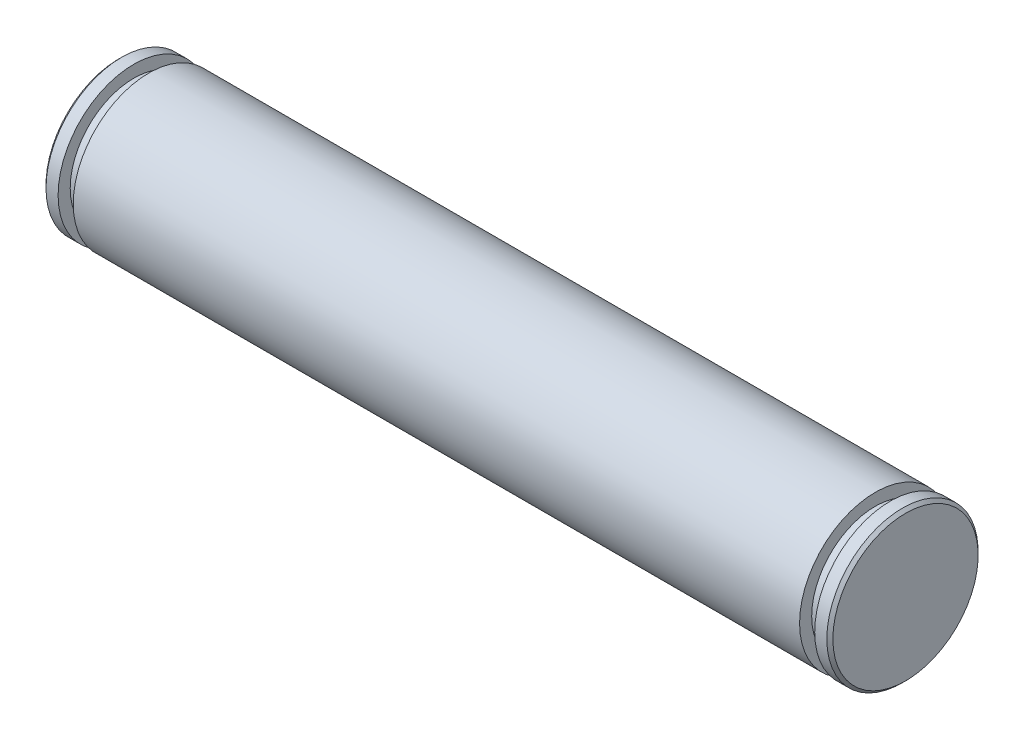
ISO-10303-21;
HEADER;
FILE_DESCRIPTION(('STEP AP214'),'2;1');
FILE_NAME('part.step','',(''),(''),'','','');
FILE_SCHEMA(('AUTOMOTIVE_DESIGN { 1 0 10303 214 1 1 1 1 }'));
ENDSEC;
DATA;
#1=APPLICATION_CONTEXT('core data for automotive mechanical design processes');
#2=APPLICATION_PROTOCOL_DEFINITION('international standard','automotive_design',2000,#1);
#3=PRODUCT_CONTEXT('',#1,'mechanical');
#4=PRODUCT('Part','Part','',(#3));
#5=PRODUCT_RELATED_PRODUCT_CATEGORY('part','',(#4));
#6=PRODUCT_DEFINITION_FORMATION('','',#4);
#7=PRODUCT_DEFINITION_CONTEXT('part definition',#1,'design');
#8=PRODUCT_DEFINITION('design','',#6,#7);
#9=PRODUCT_DEFINITION_SHAPE('','',#8);
#10=(LENGTH_UNIT() NAMED_UNIT(*) SI_UNIT(.MILLI.,.METRE.));
#11=(NAMED_UNIT(*) PLANE_ANGLE_UNIT() SI_UNIT($,.RADIAN.));
#12=(NAMED_UNIT(*) SI_UNIT($,.STERADIAN.) SOLID_ANGLE_UNIT());
#13=UNCERTAINTY_MEASURE_WITH_UNIT(LENGTH_MEASURE(1.E-05),#10,'distance_accuracy_value','');
#14=(GEOMETRIC_REPRESENTATION_CONTEXT(3) GLOBAL_UNCERTAINTY_ASSIGNED_CONTEXT((#13)) GLOBAL_UNIT_ASSIGNED_CONTEXT((#10,
#11,#12)) REPRESENTATION_CONTEXT('',''));
#15=CARTESIAN_POINT('',(0.,0.,0.));
#16=DIRECTION('',(0.,0.,1.));
#17=DIRECTION('',(1.,0.,0.));
#18=AXIS2_PLACEMENT_3D('',#15,#16,#17);
#19=CARTESIAN_POINT('',(52.,4.8,0.));
#20=DIRECTION('',(-1.,0.,0.));
#21=DIRECTION('',(0.,0.,1.));
#22=AXIS2_PLACEMENT_3D('',#19,#20,#21);
#23=PLANE('',#22);
#24=CARTESIAN_POINT('',(51.9999999999641,0.,0.));
#25=DIRECTION('',(-1.,0.,0.));
#26=DIRECTION('',(0.,0.,1.));
#27=AXIS2_PLACEMENT_3D('',#24,#25,#26);
#28=CIRCLE('',#27,4.79999999998881);
#29=CARTESIAN_POINT('',(51.9999999999641,0.,4.79999999998881));
#30=VERTEX_POINT('',#29);
#31=EDGE_CURVE('E18',#30,#30,#28,.T.);
#32=ORIENTED_EDGE('',*,*,#31,.F.);
#33=EDGE_LOOP('',(#32));
#34=FACE_BOUND('',#33,.T.);
#35=ADVANCED_FACE('F15',(#34),#23,.F.);
#36=CARTESIAN_POINT('',(0.,0.,0.));
#37=DIRECTION('',(1.,0.,0.));
#38=DIRECTION('',(0.,0.,-1.));
#39=AXIS2_PLACEMENT_3D('',#36,#37,#38);
#40=PLANE('',#39);
#41=CARTESIAN_POINT('',(5.6843418860808E-11,0.,0.));
#42=DIRECTION('',(1.,0.,0.));
#43=DIRECTION('',(0.,0.,-1.));
#44=AXIS2_PLACEMENT_3D('',#41,#42,#43);
#45=CIRCLE('',#44,4.79999999998881);
#46=CARTESIAN_POINT('',(5.6843418860808E-11,0.,-4.79999999998881));
#47=VERTEX_POINT('',#46);
#48=EDGE_CURVE('E50',#47,#47,#45,.T.);
#49=ORIENTED_EDGE('',*,*,#48,.F.);
#50=EDGE_LOOP('',(#49));
#51=FACE_BOUND('',#50,.T.);
#52=ADVANCED_FACE('F61',(#51),#40,.F.);
#53=CARTESIAN_POINT('',(51.8000000000143,0.,0.));
#54=DIRECTION('',(-1.,0.,0.));
#55=DIRECTION('',(0.,0.,1.));
#56=AXIS2_PLACEMENT_3D('',#53,#54,#55);
#57=CONICAL_SURFACE('',#56,4.99999999993861,0.785398163397448);
#58=CARTESIAN_POINT('',(51.8,0.,0.));
#59=DIRECTION('',(-1.,0.,0.));
#60=DIRECTION('',(0.,0.,1.));
#61=AXIS2_PLACEMENT_3D('',#58,#59,#60);
#62=CIRCLE('',#61,5.);
#63=CARTESIAN_POINT('',(51.8,0.,5.));
#64=VERTEX_POINT('',#63);
#65=EDGE_CURVE('E30',#64,#64,#62,.T.);
#66=ORIENTED_EDGE('',*,*,#65,.F.);
#67=EDGE_LOOP('',(#66));
#68=FACE_BOUND('',#67,.T.);
#69=ORIENTED_EDGE('',*,*,#31,.T.);
#70=EDGE_LOOP('',(#69));
#71=FACE_BOUND('',#70,.T.);
#72=ADVANCED_FACE('F58',(#68,#71),#57,.T.);
#73=CARTESIAN_POINT('',(0.200000000006639,0.,0.));
#74=DIRECTION('',(1.,0.,0.));
#75=DIRECTION('',(0.,0.,-1.));
#76=AXIS2_PLACEMENT_3D('',#73,#74,#75);
#77=CONICAL_SURFACE('',#76,4.99999999993861,0.785398163397448);
#78=CARTESIAN_POINT('',(0.200000000000006,0.,0.));
#79=DIRECTION('',(-1.,0.,0.));
#80=DIRECTION('',(0.,0.,1.));
#81=AXIS2_PLACEMENT_3D('',#78,#79,#80);
#82=CIRCLE('',#81,5.);
#83=CARTESIAN_POINT('',(0.200000000000006,0.,5.));
#84=VERTEX_POINT('',#83);
#85=EDGE_CURVE('E49',#84,#84,#82,.F.);
#86=ORIENTED_EDGE('',*,*,#85,.F.);
#87=EDGE_LOOP('',(#86));
#88=FACE_BOUND('',#87,.T.);
#89=ORIENTED_EDGE('',*,*,#48,.T.);
#90=EDGE_LOOP('',(#89));
#91=FACE_BOUND('',#90,.T.);
#92=ADVANCED_FACE('F105',(#88,#91),#77,.T.);
#93=CARTESIAN_POINT('',(-138.084352936582,0.,0.));
#94=DIRECTION('',(-1.,0.,0.));
#95=DIRECTION('',(0.,0.,1.));
#96=AXIS2_PLACEMENT_3D('',#93,#94,#95);
#97=CYLINDRICAL_SURFACE('',#96,5.);
#98=CARTESIAN_POINT('',(51.,0.,0.));
#99=DIRECTION('',(-1.,0.,0.));
#100=DIRECTION('',(0.,0.,1.));
#101=AXIS2_PLACEMENT_3D('',#98,#99,#100);
#102=CIRCLE('',#101,5.);
#103=CARTESIAN_POINT('',(51.,0.,5.));
#104=VERTEX_POINT('',#103);
#105=EDGE_CURVE('E47',#104,#104,#102,.F.);
#106=ORIENTED_EDGE('',*,*,#105,.T.);
#107=EDGE_LOOP('',(#106));
#108=FACE_BOUND('',#107,.T.);
#109=ORIENTED_EDGE('',*,*,#65,.T.);
#110=EDGE_LOOP('',(#109));
#111=FACE_BOUND('',#110,.T.);
#112=ADVANCED_FACE('F101',(#108,#111),#97,.T.);
#113=CARTESIAN_POINT('',(-138.084352936582,0.,0.));
#114=DIRECTION('',(-1.,0.,0.));
#115=DIRECTION('',(0.,0.,1.));
#116=AXIS2_PLACEMENT_3D('',#113,#114,#115);
#117=CYLINDRICAL_SURFACE('',#116,5.);
#118=ORIENTED_EDGE('',*,*,#85,.T.);
#119=EDGE_LOOP('',(#118));
#120=FACE_BOUND('',#119,.T.);
#121=CARTESIAN_POINT('',(1.,0.,0.));
#122=DIRECTION('',(-1.,0.,0.));
#123=DIRECTION('',(0.,0.,1.));
#124=AXIS2_PLACEMENT_3D('',#121,#122,#123);
#125=CIRCLE('',#124,5.);
#126=CARTESIAN_POINT('',(1.,0.,5.));
#127=VERTEX_POINT('',#126);
#128=EDGE_CURVE('E44',#127,#127,#125,.T.);
#129=ORIENTED_EDGE('',*,*,#128,.T.);
#130=EDGE_LOOP('',(#129));
#131=FACE_BOUND('',#130,.T.);
#132=ADVANCED_FACE('F97',(#120,#131),#117,.T.);
#133=CARTESIAN_POINT('',(51.,4.2,0.));
#134=DIRECTION('',(1.,0.,0.));
#135=DIRECTION('',(0.,0.,-1.));
#136=AXIS2_PLACEMENT_3D('',#133,#134,#135);
#137=PLANE('',#136);
#138=ORIENTED_EDGE('',*,*,#105,.F.);
#139=EDGE_LOOP('',(#138));
#140=FACE_BOUND('',#139,.T.);
#141=CARTESIAN_POINT('',(51.,0.,0.));
#142=DIRECTION('',(-1.,0.,0.));
#143=DIRECTION('',(0.,0.,1.));
#144=AXIS2_PLACEMENT_3D('',#141,#142,#143);
#145=CIRCLE('',#144,4.2);
#146=CARTESIAN_POINT('',(51.,0.,4.2));
#147=VERTEX_POINT('',#146);
#148=EDGE_CURVE('E41',#147,#147,#145,.T.);
#149=ORIENTED_EDGE('',*,*,#148,.F.);
#150=EDGE_LOOP('',(#149));
#151=FACE_BOUND('',#150,.T.);
#152=ADVANCED_FACE('F93',(#140,#151),#137,.F.);
#153=CARTESIAN_POINT('',(1.,5.,0.));
#154=DIRECTION('',(-1.,0.,0.));
#155=DIRECTION('',(0.,0.,1.));
#156=AXIS2_PLACEMENT_3D('',#153,#154,#155);
#157=PLANE('',#156);
#158=CARTESIAN_POINT('',(1.,0.,0.));
#159=DIRECTION('',(-1.,0.,0.));
#160=DIRECTION('',(0.,0.,1.));
#161=AXIS2_PLACEMENT_3D('',#158,#159,#160);
#162=CIRCLE('',#161,4.2);
#163=CARTESIAN_POINT('',(1.,0.,4.2));
#164=VERTEX_POINT('',#163);
#165=EDGE_CURVE('E38',#164,#164,#162,.F.);
#166=ORIENTED_EDGE('',*,*,#165,.F.);
#167=EDGE_LOOP('',(#166));
#168=FACE_BOUND('',#167,.T.);
#169=ORIENTED_EDGE('',*,*,#128,.F.);
#170=EDGE_LOOP('',(#169));
#171=FACE_BOUND('',#170,.T.);
#172=ADVANCED_FACE('F89',(#168,#171),#157,.F.);
#173=CARTESIAN_POINT('',(-138.084352936582,0.,0.));
#174=DIRECTION('',(-1.,0.,0.));
#175=DIRECTION('',(0.,0.,1.));
#176=AXIS2_PLACEMENT_3D('',#173,#174,#175);
#177=CYLINDRICAL_SURFACE('',#176,4.2);
#178=CARTESIAN_POINT('',(50.,0.,0.));
#179=DIRECTION('',(-1.,0.,0.));
#180=DIRECTION('',(0.,0.,1.));
#181=AXIS2_PLACEMENT_3D('',#178,#179,#180);
#182=CIRCLE('',#181,4.2);
#183=CARTESIAN_POINT('',(50.,0.,4.2));
#184=VERTEX_POINT('',#183);
#185=EDGE_CURVE('E35',#184,#184,#182,.F.);
#186=ORIENTED_EDGE('',*,*,#185,.T.);
#187=EDGE_LOOP('',(#186));
#188=FACE_BOUND('',#187,.T.);
#189=ORIENTED_EDGE('',*,*,#148,.T.);
#190=EDGE_LOOP('',(#189));
#191=FACE_BOUND('',#190,.T.);
#192=ADVANCED_FACE('F85',(#188,#191),#177,.T.);
#193=CARTESIAN_POINT('',(-138.084352936582,0.,0.));
#194=DIRECTION('',(-1.,0.,0.));
#195=DIRECTION('',(0.,0.,1.));
#196=AXIS2_PLACEMENT_3D('',#193,#194,#195);
#197=CYLINDRICAL_SURFACE('',#196,4.2);
#198=ORIENTED_EDGE('',*,*,#165,.T.);
#199=EDGE_LOOP('',(#198));
#200=FACE_BOUND('',#199,.T.);
#201=CARTESIAN_POINT('',(2.,0.,0.));
#202=DIRECTION('',(-1.,0.,0.));
#203=DIRECTION('',(0.,0.,1.));
#204=AXIS2_PLACEMENT_3D('',#201,#202,#203);
#205=CIRCLE('',#204,4.2);
#206=CARTESIAN_POINT('',(2.,0.,4.2));
#207=VERTEX_POINT('',#206);
#208=EDGE_CURVE('E27',#207,#207,#205,.T.);
#209=ORIENTED_EDGE('',*,*,#208,.T.);
#210=EDGE_LOOP('',(#209));
#211=FACE_BOUND('',#210,.T.);
#212=ADVANCED_FACE('F81',(#200,#211),#197,.T.);
#213=CARTESIAN_POINT('',(50.,5.,0.));
#214=DIRECTION('',(-1.,0.,0.));
#215=DIRECTION('',(0.,0.,1.));
#216=AXIS2_PLACEMENT_3D('',#213,#214,#215);
#217=PLANE('',#216);
#218=ORIENTED_EDGE('',*,*,#185,.F.);
#219=EDGE_LOOP('',(#218));
#220=FACE_BOUND('',#219,.T.);
#221=CARTESIAN_POINT('',(50.,0.,0.));
#222=DIRECTION('',(-1.,0.,0.));
#223=DIRECTION('',(0.,0.,1.));
#224=AXIS2_PLACEMENT_3D('',#221,#222,#223);
#225=CIRCLE('',#224,5.);
#226=CARTESIAN_POINT('',(50.,0.,5.));
#227=VERTEX_POINT('',#226);
#228=EDGE_CURVE('E22',#227,#227,#225,.T.);
#229=ORIENTED_EDGE('',*,*,#228,.F.);
#230=EDGE_LOOP('',(#229));
#231=FACE_BOUND('',#230,.T.);
#232=ADVANCED_FACE('F74',(#220,#231),#217,.F.);
#233=CARTESIAN_POINT('',(2.,4.2,0.));
#234=DIRECTION('',(1.,0.,0.));
#235=DIRECTION('',(0.,0.,-1.));
#236=AXIS2_PLACEMENT_3D('',#233,#234,#235);
#237=PLANE('',#236);
#238=CARTESIAN_POINT('',(2.,0.,0.));
#239=DIRECTION('',(-1.,0.,0.));
#240=DIRECTION('',(0.,0.,1.));
#241=AXIS2_PLACEMENT_3D('',#238,#239,#240);
#242=CIRCLE('',#241,5.);
#243=CARTESIAN_POINT('',(2.,0.,5.));
#244=VERTEX_POINT('',#243);
#245=EDGE_CURVE('E10',#244,#244,#242,.F.);
#246=ORIENTED_EDGE('',*,*,#245,.F.);
#247=EDGE_LOOP('',(#246));
#248=FACE_BOUND('',#247,.T.);
#249=ORIENTED_EDGE('',*,*,#208,.F.);
#250=EDGE_LOOP('',(#249));
#251=FACE_BOUND('',#250,.T.);
#252=ADVANCED_FACE('F69',(#248,#251),#237,.F.);
#253=CARTESIAN_POINT('',(-138.084352936582,0.,0.));
#254=DIRECTION('',(-1.,0.,0.));
#255=DIRECTION('',(0.,0.,1.));
#256=AXIS2_PLACEMENT_3D('',#253,#254,#255);
#257=CYLINDRICAL_SURFACE('',#256,5.);
#258=ORIENTED_EDGE('',*,*,#245,.T.);
#259=EDGE_LOOP('',(#258));
#260=FACE_BOUND('',#259,.T.);
#261=ORIENTED_EDGE('',*,*,#228,.T.);
#262=EDGE_LOOP('',(#261));
#263=FACE_BOUND('',#262,.T.);
#264=ADVANCED_FACE('F67',(#260,#263),#257,.T.);
#265=CLOSED_SHELL('',(#35,#52,#72,#92,#112,#132,#152,#172,#192,#212,#232,#252,#264));
#266=MANIFOLD_SOLID_BREP('B1',#265);
#267=ADVANCED_BREP_SHAPE_REPRESENTATION('',(#18,#266),#14);
#268=SHAPE_DEFINITION_REPRESENTATION(#9,#267);
ENDSEC;
END-ISO-10303-21;
